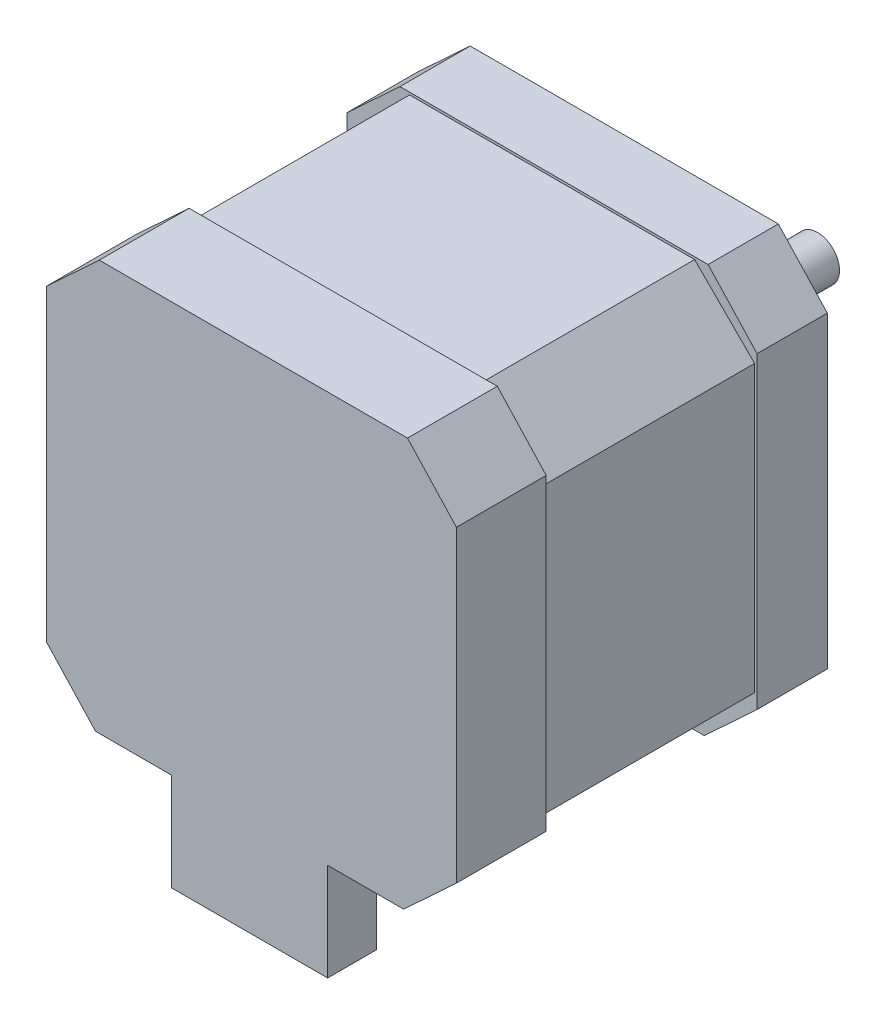
ISO-10303-21;
HEADER;
FILE_DESCRIPTION(('STEP AP214'),'2;1');
FILE_NAME('part.step','',(''),(''),'','','');
FILE_SCHEMA(('AUTOMOTIVE_DESIGN { 1 0 10303 214 1 1 1 1 }'));
ENDSEC;
DATA;
#1=APPLICATION_CONTEXT('core data for automotive mechanical design processes');
#2=APPLICATION_PROTOCOL_DEFINITION('international standard','automotive_design',2000,#1);
#3=PRODUCT_CONTEXT('',#1,'mechanical');
#4=PRODUCT('Part','Part','',(#3));
#5=PRODUCT_RELATED_PRODUCT_CATEGORY('part','',(#4));
#6=PRODUCT_DEFINITION_FORMATION('','',#4);
#7=PRODUCT_DEFINITION_CONTEXT('part definition',#1,'design');
#8=PRODUCT_DEFINITION('design','',#6,#7);
#9=PRODUCT_DEFINITION_SHAPE('','',#8);
#10=(LENGTH_UNIT() NAMED_UNIT(*) SI_UNIT(.MILLI.,.METRE.));
#11=(NAMED_UNIT(*) PLANE_ANGLE_UNIT() SI_UNIT($,.RADIAN.));
#12=(NAMED_UNIT(*) SI_UNIT($,.STERADIAN.) SOLID_ANGLE_UNIT());
#13=UNCERTAINTY_MEASURE_WITH_UNIT(LENGTH_MEASURE(1.E-05),#10,'distance_accuracy_value','');
#14=(GEOMETRIC_REPRESENTATION_CONTEXT(3) GLOBAL_UNCERTAINTY_ASSIGNED_CONTEXT((#13)) GLOBAL_UNIT_ASSIGNED_CONTEXT((#10,
#11,#12)) REPRESENTATION_CONTEXT('',''));
#15=CARTESIAN_POINT('',(0.,0.,0.));
#16=DIRECTION('',(0.,0.,1.));
#17=DIRECTION('',(1.,0.,0.));
#18=AXIS2_PLACEMENT_3D('',#15,#16,#17);
#19=CARTESIAN_POINT('',(0.,-21.,38.));
#20=DIRECTION('',(0.,1.,0.));
#21=DIRECTION('',(0.,0.,1.));
#22=AXIS2_PLACEMENT_3D('',#19,#20,#21);
#23=PLANE('',#22);
#24=DIRECTION('',(0.,0.,-1.));
#25=VECTOR('',#24,1.);
#26=CARTESIAN_POINT('',(-8.19600206182443,-21.,33.));
#27=LINE('',#26,#25);
#28=CARTESIAN_POINT('',(-8.19600206182443,-21.,38.));
#29=VERTEX_POINT('',#28);
#30=CARTESIAN_POINT('',(-8.19600206182443,-21.,33.));
#31=VERTEX_POINT('',#30);
#32=EDGE_CURVE('E290',#29,#31,#27,.T.);
#33=ORIENTED_EDGE('',*,*,#32,.F.);
#34=DIRECTION('',(1.,0.,0.));
#35=VECTOR('',#34,1.);
#36=CARTESIAN_POINT('',(0.,-21.,38.));
#37=LINE('',#36,#35);
#38=CARTESIAN_POINT('',(-15.9841759962391,-21.,38.));
#39=VERTEX_POINT('',#38);
#40=EDGE_CURVE('E441',#39,#29,#37,.T.);
#41=ORIENTED_EDGE('',*,*,#40,.F.);
#42=DIRECTION('',(0.,0.,-1.));
#43=VECTOR('',#42,1.);
#44=CARTESIAN_POINT('',(-15.9841759962391,-21.,38.));
#45=LINE('',#44,#43);
#46=CARTESIAN_POINT('',(-15.9841759962391,-21.,28.8));
#47=VERTEX_POINT('',#46);
#48=EDGE_CURVE('E477',#39,#47,#45,.T.);
#49=ORIENTED_EDGE('',*,*,#48,.T.);
#50=DIRECTION('',(-1.,0.,0.));
#51=VECTOR('',#50,1.);
#52=CARTESIAN_POINT('',(0.,-21.,28.8));
#53=LINE('',#52,#51);
#54=CARTESIAN_POINT('',(15.5921718725902,-21.,28.8));
#55=VERTEX_POINT('',#54);
#56=EDGE_CURVE('E405',#55,#47,#53,.T.);
#57=ORIENTED_EDGE('',*,*,#56,.F.);
#58=DIRECTION('',(0.,0.,-1.));
#59=VECTOR('',#58,1.);
#60=CARTESIAN_POINT('',(15.5921718725902,-21.,38.));
#61=LINE('',#60,#59);
#62=CARTESIAN_POINT('',(15.5921718725902,-21.,38.));
#63=VERTEX_POINT('',#62);
#64=EDGE_CURVE('E473',#63,#55,#61,.T.);
#65=ORIENTED_EDGE('',*,*,#64,.F.);
#66=CARTESIAN_POINT('',(7.80399793817557,-21.,38.));
#67=VERTEX_POINT('',#66);
#68=EDGE_CURVE('E105',#67,#63,#37,.T.);
#69=ORIENTED_EDGE('',*,*,#68,.F.);
#70=DIRECTION('',(0.,0.,1.));
#71=VECTOR('',#70,1.);
#72=CARTESIAN_POINT('',(7.80399793817557,-21.,33.));
#73=LINE('',#72,#71);
#74=CARTESIAN_POINT('',(7.80399793817557,-21.,33.));
#75=VERTEX_POINT('',#74);
#76=EDGE_CURVE('E287',#75,#67,#73,.T.);
#77=ORIENTED_EDGE('',*,*,#76,.F.);
#78=DIRECTION('',(1.,0.,0.));
#79=VECTOR('',#78,1.);
#80=CARTESIAN_POINT('',(7.80399793817557,-21.,33.));
#81=LINE('',#80,#79);
#82=EDGE_CURVE('E99',#31,#75,#81,.T.);
#83=ORIENTED_EDGE('',*,*,#82,.F.);
#84=EDGE_LOOP('',(#33,#41,#49,#57,#65,#69,#77,#83));
#85=FACE_BOUND('',#84,.T.);
#86=ADVANCED_FACE('F84',(#85),#23,.F.);
#87=CARTESIAN_POINT('',(21.,0.,38.));
#88=DIRECTION('',(1.,0.,0.));
#89=DIRECTION('',(0.,1.,0.));
#90=AXIS2_PLACEMENT_3D('',#87,#88,#89);
#91=PLANE('',#90);
#92=DIRECTION('',(0.,0.,-1.));
#93=VECTOR('',#92,1.);
#94=CARTESIAN_POINT('',(21.,-15.9841759962391,38.));
#95=LINE('',#94,#93);
#96=CARTESIAN_POINT('',(21.,-15.9841759962391,38.));
#97=VERTEX_POINT('',#96);
#98=CARTESIAN_POINT('',(21.,-15.9841759962391,28.8));
#99=VERTEX_POINT('',#98);
#100=EDGE_CURVE('E469',#97,#99,#95,.T.);
#101=ORIENTED_EDGE('',*,*,#100,.T.);
#102=DIRECTION('',(0.,1.,0.));
#103=VECTOR('',#102,1.);
#104=CARTESIAN_POINT('',(21.,0.,28.8));
#105=LINE('',#104,#103);
#106=CARTESIAN_POINT('',(21.,15.5921718725903,28.8));
#107=VERTEX_POINT('',#106);
#108=EDGE_CURVE('E420',#99,#107,#105,.T.);
#109=ORIENTED_EDGE('',*,*,#108,.T.);
#110=DIRECTION('',(0.,0.,-1.));
#111=VECTOR('',#110,1.);
#112=CARTESIAN_POINT('',(21.,15.5921718725903,38.));
#113=LINE('',#112,#111);
#114=CARTESIAN_POINT('',(21.,15.5921718725903,38.));
#115=VERTEX_POINT('',#114);
#116=EDGE_CURVE('E497',#115,#107,#113,.T.);
#117=ORIENTED_EDGE('',*,*,#116,.F.);
#118=DIRECTION('',(0.,-1.,0.));
#119=VECTOR('',#118,1.);
#120=CARTESIAN_POINT('',(21.,0.,38.));
#121=LINE('',#120,#119);
#122=EDGE_CURVE('E424',#115,#97,#121,.T.);
#123=ORIENTED_EDGE('',*,*,#122,.T.);
#124=EDGE_LOOP('',(#101,#109,#117,#123));
#125=FACE_BOUND('',#124,.T.);
#126=ADVANCED_FACE('F86',(#125),#91,.T.);
#127=CARTESIAN_POINT('',(19.0627004123154,17.6808781736177,38.));
#128=DIRECTION('',(-0.733180785089054,-0.680033775908373,0.));
#129=DIRECTION('',(0.680033775908373,-0.733180785089054,0.));
#130=AXIS2_PLACEMENT_3D('',#127,#128,#129);
#131=PLANE('',#130);
#132=DIRECTION('',(0.680033775908373,-0.733180785089054,0.));
#133=VECTOR('',#132,1.);
#134=CARTESIAN_POINT('',(19.0627004123154,17.6808781736177,28.8));
#135=LINE('',#134,#133);
#136=CARTESIAN_POINT('',(15.9841759962391,21.,28.8));
#137=VERTEX_POINT('',#136);
#138=EDGE_CURVE('E418',#137,#107,#135,.T.);
#139=ORIENTED_EDGE('',*,*,#138,.F.);
#140=DIRECTION('',(0.,0.,-1.));
#141=VECTOR('',#140,1.);
#142=CARTESIAN_POINT('',(15.9841759962391,21.,38.));
#143=LINE('',#142,#141);
#144=CARTESIAN_POINT('',(15.9841759962391,21.,38.));
#145=VERTEX_POINT('',#144);
#146=EDGE_CURVE('E493',#145,#137,#143,.T.);
#147=ORIENTED_EDGE('',*,*,#146,.F.);
#148=DIRECTION('',(-0.680033775908373,0.733180785089054,0.));
#149=VECTOR('',#148,1.);
#150=CARTESIAN_POINT('',(19.0627004123154,17.6808781736177,38.));
#151=LINE('',#150,#149);
#152=EDGE_CURVE('E427',#115,#145,#151,.T.);
#153=ORIENTED_EDGE('',*,*,#152,.F.);
#154=ORIENTED_EDGE('',*,*,#116,.T.);
#155=EDGE_LOOP('',(#139,#147,#153,#154));
#156=FACE_BOUND('',#155,.T.);
#157=ADVANCED_FACE('F618',(#156),#131,.F.);
#158=CARTESIAN_POINT('',(0.,21.,38.));
#159=DIRECTION('',(0.,1.,0.));
#160=DIRECTION('',(0.,0.,1.));
#161=AXIS2_PLACEMENT_3D('',#158,#159,#160);
#162=PLANE('',#161);
#163=ORIENTED_EDGE('',*,*,#146,.T.);
#164=DIRECTION('',(-1.,0.,0.));
#165=VECTOR('',#164,1.);
#166=CARTESIAN_POINT('',(0.,21.,28.8));
#167=LINE('',#166,#165);
#168=CARTESIAN_POINT('',(-15.5921718725903,21.,28.8));
#169=VERTEX_POINT('',#168);
#170=EDGE_CURVE('E415',#137,#169,#167,.T.);
#171=ORIENTED_EDGE('',*,*,#170,.T.);
#172=DIRECTION('',(0.,0.,-1.));
#173=VECTOR('',#172,1.);
#174=CARTESIAN_POINT('',(-15.5921718725903,21.,38.));
#175=LINE('',#174,#173);
#176=CARTESIAN_POINT('',(-15.5921718725903,21.,38.));
#177=VERTEX_POINT('',#176);
#178=EDGE_CURVE('E489',#177,#169,#175,.T.);
#179=ORIENTED_EDGE('',*,*,#178,.F.);
#180=DIRECTION('',(1.,0.,0.));
#181=VECTOR('',#180,1.);
#182=CARTESIAN_POINT('',(0.,21.,38.));
#183=LINE('',#182,#181);
#184=EDGE_CURVE('E430',#177,#145,#183,.T.);
#185=ORIENTED_EDGE('',*,*,#184,.T.);
#186=EDGE_LOOP('',(#163,#171,#179,#185));
#187=FACE_BOUND('',#186,.T.);
#188=ADVANCED_FACE('F663',(#187),#162,.T.);
#189=CARTESIAN_POINT('',(-17.6808781736177,19.0627004123154,38.));
#190=DIRECTION('',(-0.680033775908373,0.733180785089054,0.));
#191=DIRECTION('',(-0.733180785089054,-0.680033775908373,0.));
#192=AXIS2_PLACEMENT_3D('',#189,#190,#191);
#193=PLANE('',#192);
#194=ORIENTED_EDGE('',*,*,#178,.T.);
#195=DIRECTION('',(-0.733180785089054,-0.680033775908373,0.));
#196=VECTOR('',#195,1.);
#197=CARTESIAN_POINT('',(-17.6808781736177,19.0627004123154,28.8));
#198=LINE('',#197,#196);
#199=CARTESIAN_POINT('',(-21.,15.9841759962391,28.8));
#200=VERTEX_POINT('',#199);
#201=EDGE_CURVE('E412',#169,#200,#198,.T.);
#202=ORIENTED_EDGE('',*,*,#201,.T.);
#203=DIRECTION('',(0.,0.,-1.));
#204=VECTOR('',#203,1.);
#205=CARTESIAN_POINT('',(-21.,15.9841759962391,38.));
#206=LINE('',#205,#204);
#207=CARTESIAN_POINT('',(-21.,15.9841759962391,38.));
#208=VERTEX_POINT('',#207);
#209=EDGE_CURVE('E485',#208,#200,#206,.T.);
#210=ORIENTED_EDGE('',*,*,#209,.F.);
#211=DIRECTION('',(0.733180785089054,0.680033775908373,0.));
#212=VECTOR('',#211,1.);
#213=CARTESIAN_POINT('',(-17.6808781736177,19.0627004123154,38.));
#214=LINE('',#213,#212);
#215=EDGE_CURVE('E433',#208,#177,#214,.T.);
#216=ORIENTED_EDGE('',*,*,#215,.T.);
#217=EDGE_LOOP('',(#194,#202,#210,#216));
#218=FACE_BOUND('',#217,.T.);
#219=ADVANCED_FACE('F661',(#218),#193,.T.);
#220=CARTESIAN_POINT('',(-21.,0.,38.));
#221=DIRECTION('',(1.,0.,0.));
#222=DIRECTION('',(0.,1.,0.));
#223=AXIS2_PLACEMENT_3D('',#220,#221,#222);
#224=PLANE('',#223);
#225=DIRECTION('',(0.,1.,0.));
#226=VECTOR('',#225,1.);
#227=CARTESIAN_POINT('',(-21.,0.,28.8));
#228=LINE('',#227,#226);
#229=CARTESIAN_POINT('',(-21.,-15.5921718725903,28.8));
#230=VERTEX_POINT('',#229);
#231=EDGE_CURVE('E410',#230,#200,#228,.T.);
#232=ORIENTED_EDGE('',*,*,#231,.F.);
#233=DIRECTION('',(0.,0.,-1.));
#234=VECTOR('',#233,1.);
#235=CARTESIAN_POINT('',(-21.,-15.5921718725903,38.));
#236=LINE('',#235,#234);
#237=CARTESIAN_POINT('',(-21.,-15.5921718725903,38.));
#238=VERTEX_POINT('',#237);
#239=EDGE_CURVE('E481',#238,#230,#236,.T.);
#240=ORIENTED_EDGE('',*,*,#239,.F.);
#241=DIRECTION('',(0.,-1.,0.));
#242=VECTOR('',#241,1.);
#243=CARTESIAN_POINT('',(-21.,0.,38.));
#244=LINE('',#243,#242);
#245=EDGE_CURVE('E436',#208,#238,#244,.T.);
#246=ORIENTED_EDGE('',*,*,#245,.F.);
#247=ORIENTED_EDGE('',*,*,#209,.T.);
#248=EDGE_LOOP('',(#232,#240,#246,#247));
#249=FACE_BOUND('',#248,.T.);
#250=ADVANCED_FACE('F640',(#249),#224,.F.);
#251=CARTESIAN_POINT('',(-19.0627004123154,-17.6808781736177,38.));
#252=DIRECTION('',(-0.733180785089054,-0.680033775908373,0.));
#253=DIRECTION('',(0.680033775908373,-0.733180785089054,0.));
#254=AXIS2_PLACEMENT_3D('',#251,#252,#253);
#255=PLANE('',#254);
#256=ORIENTED_EDGE('',*,*,#239,.T.);
#257=DIRECTION('',(0.680033775908373,-0.733180785089054,0.));
#258=VECTOR('',#257,1.);
#259=CARTESIAN_POINT('',(-19.0627004123154,-17.6808781736177,28.8));
#260=LINE('',#259,#258);
#261=EDGE_CURVE('E407',#230,#47,#260,.T.);
#262=ORIENTED_EDGE('',*,*,#261,.T.);
#263=ORIENTED_EDGE('',*,*,#48,.F.);
#264=DIRECTION('',(-0.680033775908373,0.733180785089054,0.));
#265=VECTOR('',#264,1.);
#266=CARTESIAN_POINT('',(-19.0627004123154,-17.6808781736177,38.));
#267=LINE('',#266,#265);
#268=EDGE_CURVE('E438',#39,#238,#267,.T.);
#269=ORIENTED_EDGE('',*,*,#268,.T.);
#270=EDGE_LOOP('',(#256,#262,#263,#269));
#271=FACE_BOUND('',#270,.T.);
#272=ADVANCED_FACE('F627',(#271),#255,.T.);
#273=CARTESIAN_POINT('',(17.6808781736177,-19.0627004123154,38.));
#274=DIRECTION('',(-0.680033775908373,0.733180785089054,0.));
#275=DIRECTION('',(-0.733180785089054,-0.680033775908373,0.));
#276=AXIS2_PLACEMENT_3D('',#273,#274,#275);
#277=PLANE('',#276);
#278=DIRECTION('',(-0.733180785089054,-0.680033775908373,0.));
#279=VECTOR('',#278,1.);
#280=CARTESIAN_POINT('',(17.6808781736177,-19.0627004123154,28.8));
#281=LINE('',#280,#279);
#282=EDGE_CURVE('E92',#99,#55,#281,.T.);
#283=ORIENTED_EDGE('',*,*,#282,.F.);
#284=ORIENTED_EDGE('',*,*,#100,.F.);
#285=DIRECTION('',(0.733180785089054,0.680033775908373,0.));
#286=VECTOR('',#285,1.);
#287=CARTESIAN_POINT('',(17.6808781736177,-19.0627004123154,38.));
#288=LINE('',#287,#286);
#289=EDGE_CURVE('E444',#63,#97,#288,.T.);
#290=ORIENTED_EDGE('',*,*,#289,.F.);
#291=ORIENTED_EDGE('',*,*,#64,.T.);
#292=EDGE_LOOP('',(#283,#284,#290,#291));
#293=FACE_BOUND('',#292,.T.);
#294=ADVANCED_FACE('F628',(#293),#277,.F.);
#295=CARTESIAN_POINT('',(0.,0.,38.));
#296=DIRECTION('',(0.,0.,1.));
#297=DIRECTION('',(1.,0.,0.));
#298=AXIS2_PLACEMENT_3D('',#295,#296,#297);
#299=PLANE('',#298);
#300=ORIENTED_EDGE('',*,*,#122,.F.);
#301=ORIENTED_EDGE('',*,*,#152,.T.);
#302=ORIENTED_EDGE('',*,*,#184,.F.);
#303=ORIENTED_EDGE('',*,*,#215,.F.);
#304=ORIENTED_EDGE('',*,*,#245,.T.);
#305=ORIENTED_EDGE('',*,*,#268,.F.);
#306=ORIENTED_EDGE('',*,*,#40,.T.);
#307=DIRECTION('',(0.,1.,0.));
#308=VECTOR('',#307,1.);
#309=CARTESIAN_POINT('',(-8.19600206182443,-31.,38.));
#310=LINE('',#309,#308);
#311=CARTESIAN_POINT('',(-8.19600206182443,-31.,38.));
#312=VERTEX_POINT('',#311);
#313=EDGE_CURVE('E664',#312,#29,#310,.T.);
#314=ORIENTED_EDGE('',*,*,#313,.F.);
#315=DIRECTION('',(-1.,0.,0.));
#316=VECTOR('',#315,1.);
#317=CARTESIAN_POINT('',(7.80399793817557,-31.,38.));
#318=LINE('',#317,#316);
#319=CARTESIAN_POINT('',(7.80399793817557,-31.,38.));
#320=VERTEX_POINT('',#319);
#321=EDGE_CURVE('E283',#320,#312,#318,.T.);
#322=ORIENTED_EDGE('',*,*,#321,.F.);
#323=DIRECTION('',(0.,1.,0.));
#324=VECTOR('',#323,1.);
#325=CARTESIAN_POINT('',(7.80399793817557,-31.,38.));
#326=LINE('',#325,#324);
#327=EDGE_CURVE('E296',#320,#67,#326,.T.);
#328=ORIENTED_EDGE('',*,*,#327,.T.);
#329=ORIENTED_EDGE('',*,*,#68,.T.);
#330=ORIENTED_EDGE('',*,*,#289,.T.);
#331=EDGE_LOOP('',(#300,#301,#302,#303,#304,#305,#306,#314,#322,#328,#329,#330));
#332=FACE_BOUND('',#331,.T.);
#333=ADVANCED_FACE('F632',(#332),#299,.T.);
#334=CARTESIAN_POINT('',(0.,0.,28.8));
#335=DIRECTION('',(0.,0.,-1.));
#336=DIRECTION('',(-1.,0.,0.));
#337=AXIS2_PLACEMENT_3D('',#334,#335,#336);
#338=PLANE('',#337);
#339=ORIENTED_EDGE('',*,*,#282,.T.);
#340=ORIENTED_EDGE('',*,*,#56,.T.);
#341=ORIENTED_EDGE('',*,*,#261,.F.);
#342=ORIENTED_EDGE('',*,*,#231,.T.);
#343=ORIENTED_EDGE('',*,*,#201,.F.);
#344=ORIENTED_EDGE('',*,*,#170,.F.);
#345=ORIENTED_EDGE('',*,*,#138,.T.);
#346=ORIENTED_EDGE('',*,*,#108,.F.);
#347=EDGE_LOOP('',(#339,#340,#341,#342,#343,#344,#345,#346));
#348=FACE_BOUND('',#347,.T.);
#349=DIRECTION('',(-0.707106781186548,0.707106781186547,0.));
#350=VECTOR('',#349,1.);
#351=CARTESIAN_POINT('',(17.6776695296637,17.6776695296637,28.8));
#352=LINE('',#351,#350);
#353=CARTESIAN_POINT('',(20.75,14.6053390593274,28.8));
#354=VERTEX_POINT('',#353);
#355=CARTESIAN_POINT('',(14.6053390593274,20.75,28.8));
#356=VERTEX_POINT('',#355);
#357=EDGE_CURVE('E349',#354,#356,#352,.T.);
#358=ORIENTED_EDGE('',*,*,#357,.T.);
#359=DIRECTION('',(1.,0.,0.));
#360=VECTOR('',#359,1.);
#361=CARTESIAN_POINT('',(0.,20.75,28.8));
#362=LINE('',#361,#360);
#363=CARTESIAN_POINT('',(-14.6053390593274,20.75,28.8));
#364=VERTEX_POINT('',#363);
#365=EDGE_CURVE('E352',#364,#356,#362,.T.);
#366=ORIENTED_EDGE('',*,*,#365,.F.);
#367=DIRECTION('',(0.707106781186547,0.707106781186548,0.));
#368=VECTOR('',#367,1.);
#369=CARTESIAN_POINT('',(-17.6776695296637,17.6776695296637,28.8));
#370=LINE('',#369,#368);
#371=CARTESIAN_POINT('',(-20.75,14.6053390593274,28.8));
#372=VERTEX_POINT('',#371);
#373=EDGE_CURVE('E355',#372,#364,#370,.T.);
#374=ORIENTED_EDGE('',*,*,#373,.F.);
#375=DIRECTION('',(0.,1.,0.));
#376=VECTOR('',#375,1.);
#377=CARTESIAN_POINT('',(-20.75,0.,28.8));
#378=LINE('',#377,#376);
#379=CARTESIAN_POINT('',(-20.75,-14.6053390593274,28.8));
#380=VERTEX_POINT('',#379);
#381=EDGE_CURVE('E358',#380,#372,#378,.T.);
#382=ORIENTED_EDGE('',*,*,#381,.F.);
#383=DIRECTION('',(-0.707106781186547,0.707106781186548,0.));
#384=VECTOR('',#383,1.);
#385=CARTESIAN_POINT('',(-17.6776695296637,-17.6776695296637,28.8));
#386=LINE('',#385,#384);
#387=CARTESIAN_POINT('',(-14.6053390593274,-20.75,28.8));
#388=VERTEX_POINT('',#387);
#389=EDGE_CURVE('E361',#388,#380,#386,.T.);
#390=ORIENTED_EDGE('',*,*,#389,.F.);
#391=DIRECTION('',(1.,0.,0.));
#392=VECTOR('',#391,1.);
#393=CARTESIAN_POINT('',(0.,-20.75,28.8));
#394=LINE('',#393,#392);
#395=CARTESIAN_POINT('',(14.6053390593274,-20.75,28.8));
#396=VERTEX_POINT('',#395);
#397=EDGE_CURVE('E364',#388,#396,#394,.T.);
#398=ORIENTED_EDGE('',*,*,#397,.T.);
#399=DIRECTION('',(0.707106781186547,0.707106781186548,0.));
#400=VECTOR('',#399,1.);
#401=CARTESIAN_POINT('',(17.6776695296637,-17.6776695296637,28.8));
#402=LINE('',#401,#400);
#403=CARTESIAN_POINT('',(20.75,-14.6053390593274,28.8));
#404=VERTEX_POINT('',#403);
#405=EDGE_CURVE('E367',#396,#404,#402,.T.);
#406=ORIENTED_EDGE('',*,*,#405,.T.);
#407=DIRECTION('',(0.,1.,0.));
#408=VECTOR('',#407,1.);
#409=CARTESIAN_POINT('',(20.75,0.,28.8));
#410=LINE('',#409,#408);
#411=EDGE_CURVE('E327',#404,#354,#410,.T.);
#412=ORIENTED_EDGE('',*,*,#411,.T.);
#413=EDGE_LOOP('',(#358,#366,#374,#382,#390,#398,#406,#412));
#414=FACE_BOUND('',#413,.T.);
#415=ADVANCED_FACE('F579',(#348,#414),#338,.T.);
#416=CARTESIAN_POINT('',(17.6776695296637,17.6776695296637,-86.9741340859453));
#417=DIRECTION('',(0.707106781186547,0.707106781186548,0.));
#418=DIRECTION('',(-0.707106781186548,0.707106781186547,0.));
#419=AXIS2_PLACEMENT_3D('',#416,#417,#418);
#420=PLANE('',#419);
#421=DIRECTION('',(0.,0.,1.));
#422=VECTOR('',#421,1.);
#423=CARTESIAN_POINT('',(14.6053390593274,20.75,-86.9741340859453));
#424=LINE('',#423,#422);
#425=CARTESIAN_POINT('',(14.6053390593274,20.75,7.2));
#426=VERTEX_POINT('',#425);
#427=EDGE_CURVE('E383',#426,#356,#424,.T.);
#428=ORIENTED_EDGE('',*,*,#427,.T.);
#429=ORIENTED_EDGE('',*,*,#357,.F.);
#430=DIRECTION('',(0.,0.,1.));
#431=VECTOR('',#430,1.);
#432=CARTESIAN_POINT('',(20.75,14.6053390593274,-86.9741340859453));
#433=LINE('',#432,#431);
#434=CARTESIAN_POINT('',(20.75,14.6053390593274,7.2));
#435=VERTEX_POINT('',#434);
#436=EDGE_CURVE('E370',#435,#354,#433,.T.);
#437=ORIENTED_EDGE('',*,*,#436,.F.);
#438=DIRECTION('',(0.707106781186548,-0.707106781186547,0.));
#439=VECTOR('',#438,1.);
#440=CARTESIAN_POINT('',(17.6776695296637,17.6776695296637,7.2));
#441=LINE('',#440,#439);
#442=EDGE_CURVE('E346',#426,#435,#441,.T.);
#443=ORIENTED_EDGE('',*,*,#442,.F.);
#444=EDGE_LOOP('',(#428,#429,#437,#443));
#445=FACE_BOUND('',#444,.T.);
#446=ADVANCED_FACE('F573',(#445),#420,.T.);
#447=CARTESIAN_POINT('',(0.,20.75,-86.9741340859453));
#448=DIRECTION('',(0.,-1.,0.));
#449=DIRECTION('',(0.,0.,-1.));
#450=AXIS2_PLACEMENT_3D('',#447,#448,#449);
#451=PLANE('',#450);
#452=DIRECTION('',(-1.,0.,0.));
#453=VECTOR('',#452,1.);
#454=CARTESIAN_POINT('',(0.,20.75,7.2));
#455=LINE('',#454,#453);
#456=CARTESIAN_POINT('',(-14.6053390593274,20.75,7.2));
#457=VERTEX_POINT('',#456);
#458=EDGE_CURVE('E328',#426,#457,#455,.T.);
#459=ORIENTED_EDGE('',*,*,#458,.T.);
#460=DIRECTION('',(0.,0.,1.));
#461=VECTOR('',#460,1.);
#462=CARTESIAN_POINT('',(-14.6053390593274,20.75,-86.9741340859453));
#463=LINE('',#462,#461);
#464=EDGE_CURVE('E381',#457,#364,#463,.T.);
#465=ORIENTED_EDGE('',*,*,#464,.T.);
#466=ORIENTED_EDGE('',*,*,#365,.T.);
#467=ORIENTED_EDGE('',*,*,#427,.F.);
#468=EDGE_LOOP('',(#459,#465,#466,#467));
#469=FACE_BOUND('',#468,.T.);
#470=ADVANCED_FACE('F604',(#469),#451,.F.);
#471=CARTESIAN_POINT('',(-17.6776695296637,17.6776695296637,-86.9741340859453));
#472=DIRECTION('',(0.707106781186548,-0.707106781186547,0.));
#473=DIRECTION('',(0.707106781186547,0.707106781186548,0.));
#474=AXIS2_PLACEMENT_3D('',#471,#472,#473);
#475=PLANE('',#474);
#476=DIRECTION('',(-0.707106781186547,-0.707106781186548,0.));
#477=VECTOR('',#476,1.);
#478=CARTESIAN_POINT('',(-17.6776695296637,17.6776695296637,7.2));
#479=LINE('',#478,#477);
#480=CARTESIAN_POINT('',(-20.75,14.6053390593274,7.2));
#481=VERTEX_POINT('',#480);
#482=EDGE_CURVE('E331',#457,#481,#479,.T.);
#483=ORIENTED_EDGE('',*,*,#482,.T.);
#484=DIRECTION('',(0.,0.,1.));
#485=VECTOR('',#484,1.);
#486=CARTESIAN_POINT('',(-20.75,14.6053390593274,-86.9741340859453));
#487=LINE('',#486,#485);
#488=EDGE_CURVE('E379',#481,#372,#487,.T.);
#489=ORIENTED_EDGE('',*,*,#488,.T.);
#490=ORIENTED_EDGE('',*,*,#373,.T.);
#491=ORIENTED_EDGE('',*,*,#464,.F.);
#492=EDGE_LOOP('',(#483,#489,#490,#491));
#493=FACE_BOUND('',#492,.T.);
#494=ADVANCED_FACE('F602',(#493),#475,.F.);
#495=CARTESIAN_POINT('',(-20.75,0.,-86.9741340859453));
#496=DIRECTION('',(1.,0.,0.));
#497=DIRECTION('',(0.,0.,-1.));
#498=AXIS2_PLACEMENT_3D('',#495,#496,#497);
#499=PLANE('',#498);
#500=DIRECTION('',(0.,-1.,0.));
#501=VECTOR('',#500,1.);
#502=CARTESIAN_POINT('',(-20.75,0.,7.2));
#503=LINE('',#502,#501);
#504=CARTESIAN_POINT('',(-20.75,-14.6053390593274,7.2));
#505=VERTEX_POINT('',#504);
#506=EDGE_CURVE('E333',#481,#505,#503,.T.);
#507=ORIENTED_EDGE('',*,*,#506,.T.);
#508=DIRECTION('',(0.,0.,1.));
#509=VECTOR('',#508,1.);
#510=CARTESIAN_POINT('',(-20.75,-14.6053390593274,-86.9741340859453));
#511=LINE('',#510,#509);
#512=EDGE_CURVE('E377',#505,#380,#511,.T.);
#513=ORIENTED_EDGE('',*,*,#512,.T.);
#514=ORIENTED_EDGE('',*,*,#381,.T.);
#515=ORIENTED_EDGE('',*,*,#488,.F.);
#516=EDGE_LOOP('',(#507,#513,#514,#515));
#517=FACE_BOUND('',#516,.T.);
#518=ADVANCED_FACE('F599',(#517),#499,.F.);
#519=CARTESIAN_POINT('',(-17.6776695296637,-17.6776695296637,-86.9741340859453));
#520=DIRECTION('',(0.707106781186548,0.707106781186547,0.));
#521=DIRECTION('',(-0.707106781186547,0.707106781186548,0.));
#522=AXIS2_PLACEMENT_3D('',#519,#520,#521);
#523=PLANE('',#522);
#524=DIRECTION('',(0.707106781186547,-0.707106781186548,0.));
#525=VECTOR('',#524,1.);
#526=CARTESIAN_POINT('',(-17.6776695296637,-17.6776695296637,7.2));
#527=LINE('',#526,#525);
#528=CARTESIAN_POINT('',(-14.6053390593274,-20.75,7.2));
#529=VERTEX_POINT('',#528);
#530=EDGE_CURVE('E335',#505,#529,#527,.T.);
#531=ORIENTED_EDGE('',*,*,#530,.T.);
#532=DIRECTION('',(0.,0.,1.));
#533=VECTOR('',#532,1.);
#534=CARTESIAN_POINT('',(-14.6053390593274,-20.75,-86.9741340859453));
#535=LINE('',#534,#533);
#536=EDGE_CURVE('E375',#529,#388,#535,.T.);
#537=ORIENTED_EDGE('',*,*,#536,.T.);
#538=ORIENTED_EDGE('',*,*,#389,.T.);
#539=ORIENTED_EDGE('',*,*,#512,.F.);
#540=EDGE_LOOP('',(#531,#537,#538,#539));
#541=FACE_BOUND('',#540,.T.);
#542=ADVANCED_FACE('F593',(#541),#523,.F.);
#543=CARTESIAN_POINT('',(0.,-20.75,-86.9741340859453));
#544=DIRECTION('',(0.,-1.,0.));
#545=DIRECTION('',(0.,0.,-1.));
#546=AXIS2_PLACEMENT_3D('',#543,#544,#545);
#547=PLANE('',#546);
#548=DIRECTION('',(0.,0.,1.));
#549=VECTOR('',#548,1.);
#550=CARTESIAN_POINT('',(14.6053390593274,-20.75,-86.9741340859453));
#551=LINE('',#550,#549);
#552=CARTESIAN_POINT('',(14.6053390593274,-20.75,7.2));
#553=VERTEX_POINT('',#552);
#554=EDGE_CURVE('E373',#553,#396,#551,.T.);
#555=ORIENTED_EDGE('',*,*,#554,.T.);
#556=ORIENTED_EDGE('',*,*,#397,.F.);
#557=ORIENTED_EDGE('',*,*,#536,.F.);
#558=DIRECTION('',(-1.,0.,0.));
#559=VECTOR('',#558,1.);
#560=CARTESIAN_POINT('',(0.,-20.75,7.2));
#561=LINE('',#560,#559);
#562=EDGE_CURVE('E337',#553,#529,#561,.T.);
#563=ORIENTED_EDGE('',*,*,#562,.F.);
#564=EDGE_LOOP('',(#555,#556,#557,#563));
#565=FACE_BOUND('',#564,.T.);
#566=ADVANCED_FACE('F591',(#565),#547,.T.);
#567=CARTESIAN_POINT('',(17.6776695296637,-17.6776695296637,-86.9741340859453));
#568=DIRECTION('',(0.707106781186548,-0.707106781186547,0.));
#569=DIRECTION('',(0.707106781186547,0.707106781186548,0.));
#570=AXIS2_PLACEMENT_3D('',#567,#568,#569);
#571=PLANE('',#570);
#572=DIRECTION('',(0.,0.,1.));
#573=VECTOR('',#572,1.);
#574=CARTESIAN_POINT('',(20.75,-14.6053390593274,-86.9741340859453));
#575=LINE('',#574,#573);
#576=CARTESIAN_POINT('',(20.75,-14.6053390593274,7.2));
#577=VERTEX_POINT('',#576);
#578=EDGE_CURVE('E371',#577,#404,#575,.T.);
#579=ORIENTED_EDGE('',*,*,#578,.T.);
#580=ORIENTED_EDGE('',*,*,#405,.F.);
#581=ORIENTED_EDGE('',*,*,#554,.F.);
#582=DIRECTION('',(-0.707106781186547,-0.707106781186548,0.));
#583=VECTOR('',#582,1.);
#584=CARTESIAN_POINT('',(17.6776695296637,-17.6776695296637,7.2));
#585=LINE('',#584,#583);
#586=EDGE_CURVE('E340',#577,#553,#585,.T.);
#587=ORIENTED_EDGE('',*,*,#586,.F.);
#588=EDGE_LOOP('',(#579,#580,#581,#587));
#589=FACE_BOUND('',#588,.T.);
#590=ADVANCED_FACE('F586',(#589),#571,.T.);
#591=CARTESIAN_POINT('',(20.75,0.,-86.9741340859453));
#592=DIRECTION('',(1.,0.,0.));
#593=DIRECTION('',(0.,0.,-1.));
#594=AXIS2_PLACEMENT_3D('',#591,#592,#593);
#595=PLANE('',#594);
#596=ORIENTED_EDGE('',*,*,#436,.T.);
#597=ORIENTED_EDGE('',*,*,#411,.F.);
#598=ORIENTED_EDGE('',*,*,#578,.F.);
#599=DIRECTION('',(0.,-1.,0.));
#600=VECTOR('',#599,1.);
#601=CARTESIAN_POINT('',(20.75,0.,7.2));
#602=LINE('',#601,#600);
#603=EDGE_CURVE('E343',#435,#577,#602,.T.);
#604=ORIENTED_EDGE('',*,*,#603,.F.);
#605=EDGE_LOOP('',(#596,#597,#598,#604));
#606=FACE_BOUND('',#605,.T.);
#607=ADVANCED_FACE('F566',(#606),#595,.T.);
#608=CARTESIAN_POINT('',(0.,0.,7.2));
#609=DIRECTION('',(0.,0.,1.));
#610=DIRECTION('',(1.,0.,0.));
#611=AXIS2_PLACEMENT_3D('',#608,#609,#610);
#612=PLANE('',#611);
#613=DIRECTION('',(-0.680033775908373,0.733180785089054,0.));
#614=VECTOR('',#613,1.);
#615=CARTESIAN_POINT('',(19.0627004123154,17.6808781736177,7.2));
#616=LINE('',#615,#614);
#617=CARTESIAN_POINT('',(21.,15.5921718725903,7.2));
#618=VERTEX_POINT('',#617);
#619=CARTESIAN_POINT('',(15.9841759962391,21.,7.2));
#620=VERTEX_POINT('',#619);
#621=EDGE_CURVE('E400',#618,#620,#616,.T.);
#622=ORIENTED_EDGE('',*,*,#621,.T.);
#623=DIRECTION('',(1.,0.,0.));
#624=VECTOR('',#623,1.);
#625=CARTESIAN_POINT('',(0.,21.,7.2));
#626=LINE('',#625,#624);
#627=CARTESIAN_POINT('',(-15.5921718725903,21.,7.2));
#628=VERTEX_POINT('',#627);
#629=EDGE_CURVE('E397',#628,#620,#626,.T.);
#630=ORIENTED_EDGE('',*,*,#629,.F.);
#631=DIRECTION('',(0.733180785089054,0.680033775908373,0.));
#632=VECTOR('',#631,1.);
#633=CARTESIAN_POINT('',(-17.6808781736177,19.0627004123154,7.2));
#634=LINE('',#633,#632);
#635=CARTESIAN_POINT('',(-21.,15.9841759962391,7.2));
#636=VERTEX_POINT('',#635);
#637=EDGE_CURVE('E394',#636,#628,#634,.T.);
#638=ORIENTED_EDGE('',*,*,#637,.F.);
#639=DIRECTION('',(0.,-1.,0.));
#640=VECTOR('',#639,1.);
#641=CARTESIAN_POINT('',(-21.,0.,7.2));
#642=LINE('',#641,#640);
#643=CARTESIAN_POINT('',(-21.,-15.5921718725903,7.2));
#644=VERTEX_POINT('',#643);
#645=EDGE_CURVE('E392',#636,#644,#642,.T.);
#646=ORIENTED_EDGE('',*,*,#645,.T.);
#647=DIRECTION('',(-0.680033775908373,0.733180785089054,0.));
#648=VECTOR('',#647,1.);
#649=CARTESIAN_POINT('',(-19.0627004123154,-17.6808781736177,7.2));
#650=LINE('',#649,#648);
#651=CARTESIAN_POINT('',(-15.9841759962391,-21.,7.2));
#652=VERTEX_POINT('',#651);
#653=EDGE_CURVE('E389',#652,#644,#650,.T.);
#654=ORIENTED_EDGE('',*,*,#653,.F.);
#655=DIRECTION('',(1.,0.,0.));
#656=VECTOR('',#655,1.);
#657=CARTESIAN_POINT('',(0.,-21.,7.2));
#658=LINE('',#657,#656);
#659=CARTESIAN_POINT('',(15.5921718725902,-21.,7.2));
#660=VERTEX_POINT('',#659);
#661=EDGE_CURVE('E330',#652,#660,#658,.T.);
#662=ORIENTED_EDGE('',*,*,#661,.T.);
#663=DIRECTION('',(0.733180785089054,0.680033775908373,0.));
#664=VECTOR('',#663,1.);
#665=CARTESIAN_POINT('',(17.6808781736177,-19.0627004123154,7.2));
#666=LINE('',#665,#664);
#667=CARTESIAN_POINT('',(21.,-15.9841759962391,7.2));
#668=VERTEX_POINT('',#667);
#669=EDGE_CURVE('E500',#660,#668,#666,.T.);
#670=ORIENTED_EDGE('',*,*,#669,.T.);
#671=DIRECTION('',(0.,-1.,0.));
#672=VECTOR('',#671,1.);
#673=CARTESIAN_POINT('',(21.,0.,7.2));
#674=LINE('',#673,#672);
#675=EDGE_CURVE('E402',#618,#668,#674,.T.);
#676=ORIENTED_EDGE('',*,*,#675,.F.);
#677=EDGE_LOOP('',(#622,#630,#638,#646,#654,#662,#670,#676));
#678=FACE_BOUND('',#677,.T.);
#679=ORIENTED_EDGE('',*,*,#442,.T.);
#680=ORIENTED_EDGE('',*,*,#603,.T.);
#681=ORIENTED_EDGE('',*,*,#586,.T.);
#682=ORIENTED_EDGE('',*,*,#562,.T.);
#683=ORIENTED_EDGE('',*,*,#530,.F.);
#684=ORIENTED_EDGE('',*,*,#506,.F.);
#685=ORIENTED_EDGE('',*,*,#482,.F.);
#686=ORIENTED_EDGE('',*,*,#458,.F.);
#687=EDGE_LOOP('',(#679,#680,#681,#682,#683,#684,#685,#686));
#688=FACE_BOUND('',#687,.T.);
#689=ADVANCED_FACE('F526',(#678,#688),#612,.T.);
#690=CARTESIAN_POINT('',(0.,0.,0.));
#691=DIRECTION('',(0.,0.,1.));
#692=DIRECTION('',(1.,0.,0.));
#693=AXIS2_PLACEMENT_3D('',#690,#691,#692);
#694=PLANE('',#693);
#695=CARTESIAN_POINT('',(15.5,-15.5,0.));
#696=DIRECTION('',(0.,0.,-1.));
#697=DIRECTION('',(-1.,0.,0.));
#698=AXIS2_PLACEMENT_3D('',#695,#696,#697);
#699=CIRCLE('',#698,1.5);
#700=CARTESIAN_POINT('',(14.,-15.5,0.));
#701=VERTEX_POINT('',#700);
#702=EDGE_CURVE('E304',#701,#701,#699,.T.);
#703=ORIENTED_EDGE('',*,*,#702,.F.);
#704=EDGE_LOOP('',(#703));
#705=FACE_BOUND('',#704,.T.);
#706=CARTESIAN_POINT('',(15.5,15.5,0.));
#707=DIRECTION('',(0.,0.,-1.));
#708=DIRECTION('',(-1.,0.,0.));
#709=AXIS2_PLACEMENT_3D('',#706,#707,#708);
#710=CIRCLE('',#709,1.5);
#711=CARTESIAN_POINT('',(14.,15.5,0.));
#712=VERTEX_POINT('',#711);
#713=EDGE_CURVE('E310',#712,#712,#710,.T.);
#714=ORIENTED_EDGE('',*,*,#713,.F.);
#715=EDGE_LOOP('',(#714));
#716=FACE_BOUND('',#715,.T.);
#717=CARTESIAN_POINT('',(-15.5,15.5,0.));
#718=DIRECTION('',(0.,0.,-1.));
#719=DIRECTION('',(-1.,0.,0.));
#720=AXIS2_PLACEMENT_3D('',#717,#718,#719);
#721=CIRCLE('',#720,1.5);
#722=CARTESIAN_POINT('',(-17.,15.5,0.));
#723=VERTEX_POINT('',#722);
#724=EDGE_CURVE('E291',#723,#723,#721,.T.);
#725=ORIENTED_EDGE('',*,*,#724,.F.);
#726=EDGE_LOOP('',(#725));
#727=FACE_BOUND('',#726,.T.);
#728=CARTESIAN_POINT('',(-15.5,-15.5,0.));
#729=DIRECTION('',(0.,0.,-1.));
#730=DIRECTION('',(-1.,0.,0.));
#731=AXIS2_PLACEMENT_3D('',#728,#729,#730);
#732=CIRCLE('',#731,1.5);
#733=CARTESIAN_POINT('',(-17.,-15.5,0.));
#734=VERTEX_POINT('',#733);
#735=EDGE_CURVE('E303',#734,#734,#732,.T.);
#736=ORIENTED_EDGE('',*,*,#735,.F.);
#737=EDGE_LOOP('',(#736));
#738=FACE_BOUND('',#737,.T.);
#739=CARTESIAN_POINT('',(0.,0.,0.));
#740=DIRECTION('',(0.,0.,1.));
#741=DIRECTION('',(1.,0.,0.));
#742=AXIS2_PLACEMENT_3D('',#739,#740,#741);
#743=CIRCLE('',#742,10.);
#744=CARTESIAN_POINT('',(10.,0.,0.));
#745=VERTEX_POINT('',#744);
#746=EDGE_CURVE('E13',#745,#745,#743,.F.);
#747=ORIENTED_EDGE('',*,*,#746,.F.);
#748=EDGE_LOOP('',(#747));
#749=FACE_BOUND('',#748,.T.);
#750=DIRECTION('',(0.,-1.,0.));
#751=VECTOR('',#750,1.);
#752=CARTESIAN_POINT('',(21.,0.,0.));
#753=LINE('',#752,#751);
#754=CARTESIAN_POINT('',(21.,15.5921718725903,0.));
#755=VERTEX_POINT('',#754);
#756=CARTESIAN_POINT('',(21.,-15.9841759962391,0.));
#757=VERTEX_POINT('',#756);
#758=EDGE_CURVE('E423',#755,#757,#753,.T.);
#759=ORIENTED_EDGE('',*,*,#758,.T.);
#760=DIRECTION('',(0.733180785089054,0.680033775908373,0.));
#761=VECTOR('',#760,1.);
#762=CARTESIAN_POINT('',(17.6808781736177,-19.0627004123154,0.));
#763=LINE('',#762,#761);
#764=CARTESIAN_POINT('',(15.5921718725902,-21.,0.));
#765=VERTEX_POINT('',#764);
#766=EDGE_CURVE('E428',#765,#757,#763,.T.);
#767=ORIENTED_EDGE('',*,*,#766,.F.);
#768=DIRECTION('',(1.,0.,0.));
#769=VECTOR('',#768,1.);
#770=CARTESIAN_POINT('',(0.,-21.,0.));
#771=LINE('',#770,#769);
#772=CARTESIAN_POINT('',(-15.9841759962391,-21.,0.));
#773=VERTEX_POINT('',#772);
#774=EDGE_CURVE('E464',#773,#765,#771,.T.);
#775=ORIENTED_EDGE('',*,*,#774,.F.);
#776=DIRECTION('',(-0.680033775908373,0.733180785089054,0.));
#777=VECTOR('',#776,1.);
#778=CARTESIAN_POINT('',(-19.0627004123154,-17.6808781736177,0.));
#779=LINE('',#778,#777);
#780=CARTESIAN_POINT('',(-21.,-15.5921718725903,0.));
#781=VERTEX_POINT('',#780);
#782=EDGE_CURVE('E461',#773,#781,#779,.T.);
#783=ORIENTED_EDGE('',*,*,#782,.T.);
#784=DIRECTION('',(0.,-1.,0.));
#785=VECTOR('',#784,1.);
#786=CARTESIAN_POINT('',(-21.,0.,0.));
#787=LINE('',#786,#785);
#788=CARTESIAN_POINT('',(-21.,15.9841759962391,0.));
#789=VERTEX_POINT('',#788);
#790=EDGE_CURVE('E458',#789,#781,#787,.T.);
#791=ORIENTED_EDGE('',*,*,#790,.F.);
#792=DIRECTION('',(0.733180785089054,0.680033775908373,0.));
#793=VECTOR('',#792,1.);
#794=CARTESIAN_POINT('',(-17.6808781736177,19.0627004123154,0.));
#795=LINE('',#794,#793);
#796=CARTESIAN_POINT('',(-15.5921718725903,21.,0.));
#797=VERTEX_POINT('',#796);
#798=EDGE_CURVE('E455',#789,#797,#795,.T.);
#799=ORIENTED_EDGE('',*,*,#798,.T.);
#800=DIRECTION('',(1.,0.,0.));
#801=VECTOR('',#800,1.);
#802=CARTESIAN_POINT('',(0.,21.,0.));
#803=LINE('',#802,#801);
#804=CARTESIAN_POINT('',(15.9841759962391,21.,0.));
#805=VERTEX_POINT('',#804);
#806=EDGE_CURVE('E452',#797,#805,#803,.T.);
#807=ORIENTED_EDGE('',*,*,#806,.T.);
#808=DIRECTION('',(-0.680033775908373,0.733180785089054,0.));
#809=VECTOR('',#808,1.);
#810=CARTESIAN_POINT('',(19.0627004123154,17.6808781736177,0.));
#811=LINE('',#810,#809);
#812=EDGE_CURVE('E449',#755,#805,#811,.T.);
#813=ORIENTED_EDGE('',*,*,#812,.F.);
#814=EDGE_LOOP('',(#759,#767,#775,#783,#791,#799,#807,#813));
#815=FACE_BOUND('',#814,.T.);
#816=ADVANCED_FACE('F522',(#705,#716,#727,#738,#749,#815),#694,.F.);
#817=ORIENTED_EDGE('',*,*,#669,.F.);
#818=EDGE_CURVE('E472',#660,#765,#61,.T.);
#819=ORIENTED_EDGE('',*,*,#818,.T.);
#820=ORIENTED_EDGE('',*,*,#766,.T.);
#821=EDGE_CURVE('E446',#668,#757,#95,.T.);
#822=ORIENTED_EDGE('',*,*,#821,.F.);
#823=EDGE_LOOP('',(#817,#819,#820,#822));
#824=FACE_BOUND('',#823,.T.);
#825=ADVANCED_FACE('F525',(#824),#277,.F.);
#826=ORIENTED_EDGE('',*,*,#661,.F.);
#827=EDGE_CURVE('E476',#652,#773,#45,.T.);
#828=ORIENTED_EDGE('',*,*,#827,.T.);
#829=ORIENTED_EDGE('',*,*,#774,.T.);
#830=ORIENTED_EDGE('',*,*,#818,.F.);
#831=EDGE_LOOP('',(#826,#828,#829,#830));
#832=FACE_BOUND('',#831,.T.);
#833=ADVANCED_FACE('F541',(#832),#23,.F.);
#834=ORIENTED_EDGE('',*,*,#827,.F.);
#835=ORIENTED_EDGE('',*,*,#653,.T.);
#836=EDGE_CURVE('E480',#644,#781,#236,.T.);
#837=ORIENTED_EDGE('',*,*,#836,.T.);
#838=ORIENTED_EDGE('',*,*,#782,.F.);
#839=EDGE_LOOP('',(#834,#835,#837,#838));
#840=FACE_BOUND('',#839,.T.);
#841=ADVANCED_FACE('F546',(#840),#255,.T.);
#842=ORIENTED_EDGE('',*,*,#645,.F.);
#843=EDGE_CURVE('E484',#636,#789,#206,.T.);
#844=ORIENTED_EDGE('',*,*,#843,.T.);
#845=ORIENTED_EDGE('',*,*,#790,.T.);
#846=ORIENTED_EDGE('',*,*,#836,.F.);
#847=EDGE_LOOP('',(#842,#844,#845,#846));
#848=FACE_BOUND('',#847,.T.);
#849=ADVANCED_FACE('F550',(#848),#224,.F.);
#850=ORIENTED_EDGE('',*,*,#843,.F.);
#851=ORIENTED_EDGE('',*,*,#637,.T.);
#852=EDGE_CURVE('E488',#628,#797,#175,.T.);
#853=ORIENTED_EDGE('',*,*,#852,.T.);
#854=ORIENTED_EDGE('',*,*,#798,.F.);
#855=EDGE_LOOP('',(#850,#851,#853,#854));
#856=FACE_BOUND('',#855,.T.);
#857=ADVANCED_FACE('F554',(#856),#193,.T.);
#858=ORIENTED_EDGE('',*,*,#852,.F.);
#859=ORIENTED_EDGE('',*,*,#629,.T.);
#860=EDGE_CURVE('E492',#620,#805,#143,.T.);
#861=ORIENTED_EDGE('',*,*,#860,.T.);
#862=ORIENTED_EDGE('',*,*,#806,.F.);
#863=EDGE_LOOP('',(#858,#859,#861,#862));
#864=FACE_BOUND('',#863,.T.);
#865=ADVANCED_FACE('F558',(#864),#162,.T.);
#866=ORIENTED_EDGE('',*,*,#621,.F.);
#867=EDGE_CURVE('E496',#618,#755,#113,.T.);
#868=ORIENTED_EDGE('',*,*,#867,.T.);
#869=ORIENTED_EDGE('',*,*,#812,.T.);
#870=ORIENTED_EDGE('',*,*,#860,.F.);
#871=EDGE_LOOP('',(#866,#868,#869,#870));
#872=FACE_BOUND('',#871,.T.);
#873=ADVANCED_FACE('F562',(#872),#131,.F.);
#874=ORIENTED_EDGE('',*,*,#867,.F.);
#875=ORIENTED_EDGE('',*,*,#675,.T.);
#876=ORIENTED_EDGE('',*,*,#821,.T.);
#877=ORIENTED_EDGE('',*,*,#758,.F.);
#878=EDGE_LOOP('',(#874,#875,#876,#877));
#879=FACE_BOUND('',#878,.T.);
#880=ADVANCED_FACE('F518',(#879),#91,.T.);
#881=CARTESIAN_POINT('',(0.,0.,-2.));
#882=DIRECTION('',(0.,0.,1.));
#883=DIRECTION('',(1.,0.,0.));
#884=AXIS2_PLACEMENT_3D('',#881,#882,#883);
#885=CYLINDRICAL_SURFACE('',#884,10.);
#886=CARTESIAN_POINT('',(0.,0.,-2.));
#887=DIRECTION('',(0.,0.,-1.));
#888=DIRECTION('',(-1.,0.,0.));
#889=AXIS2_PLACEMENT_3D('',#886,#887,#888);
#890=CIRCLE('',#889,10.);
#891=CARTESIAN_POINT('',(-10.,0.,-2.));
#892=VERTEX_POINT('',#891);
#893=EDGE_CURVE('E318',#892,#892,#890,.T.);
#894=ORIENTED_EDGE('',*,*,#893,.F.);
#895=EDGE_LOOP('',(#894));
#896=FACE_BOUND('',#895,.T.);
#897=ORIENTED_EDGE('',*,*,#746,.T.);
#898=EDGE_LOOP('',(#897));
#899=FACE_BOUND('',#898,.T.);
#900=ADVANCED_FACE('F512',(#896,#899),#885,.T.);
#901=CARTESIAN_POINT('',(0.,0.,-2.));
#902=DIRECTION('',(0.,0.,-1.));
#903=DIRECTION('',(-1.,0.,0.));
#904=AXIS2_PLACEMENT_3D('',#901,#902,#903);
#905=PLANE('',#904);
#906=CARTESIAN_POINT('',(0.,0.,-2.));
#907=DIRECTION('',(0.,0.,-1.));
#908=DIRECTION('',(-1.,0.,0.));
#909=AXIS2_PLACEMENT_3D('',#906,#907,#908);
#910=CIRCLE('',#909,2.25);
#911=CARTESIAN_POINT('',(-2.25,0.,-2.));
#912=VERTEX_POINT('',#911);
#913=EDGE_CURVE('E323',#912,#912,#910,.T.);
#914=ORIENTED_EDGE('',*,*,#913,.F.);
#915=EDGE_LOOP('',(#914));
#916=FACE_BOUND('',#915,.T.);
#917=ORIENTED_EDGE('',*,*,#893,.T.);
#918=EDGE_LOOP('',(#917));
#919=FACE_BOUND('',#918,.T.);
#920=ADVANCED_FACE('F508',(#916,#919),#905,.T.);
#921=CARTESIAN_POINT('',(0.,0.,-20.));
#922=DIRECTION('',(0.,0.,-1.));
#923=DIRECTION('',(-1.,0.,0.));
#924=AXIS2_PLACEMENT_3D('',#921,#922,#923);
#925=PLANE('',#924);
#926=CARTESIAN_POINT('',(0.,0.,-20.));
#927=DIRECTION('',(0.,0.,-1.));
#928=DIRECTION('',(-1.,0.,0.));
#929=AXIS2_PLACEMENT_3D('',#926,#927,#928);
#930=CIRCLE('',#929,2.25);
#931=CARTESIAN_POINT('',(-2.25,0.,-20.));
#932=VERTEX_POINT('',#931);
#933=EDGE_CURVE('E324',#932,#932,#930,.T.);
#934=ORIENTED_EDGE('',*,*,#933,.T.);
#935=EDGE_LOOP('',(#934));
#936=FACE_BOUND('',#935,.T.);
#937=ADVANCED_FACE('F511',(#936),#925,.T.);
#938=CARTESIAN_POINT('',(0.,0.,-20.));
#939=DIRECTION('',(0.,0.,1.));
#940=DIRECTION('',(1.,0.,0.));
#941=AXIS2_PLACEMENT_3D('',#938,#939,#940);
#942=CYLINDRICAL_SURFACE('',#941,2.25);
#943=ORIENTED_EDGE('',*,*,#913,.T.);
#944=EDGE_LOOP('',(#943));
#945=FACE_BOUND('',#944,.T.);
#946=ORIENTED_EDGE('',*,*,#933,.F.);
#947=EDGE_LOOP('',(#946));
#948=FACE_BOUND('',#947,.T.);
#949=ADVANCED_FACE('F505',(#945,#948),#942,.T.);
#950=CARTESIAN_POINT('',(-15.5,-15.5,10.));
#951=DIRECTION('',(0.,0.,-1.));
#952=DIRECTION('',(-1.,0.,0.));
#953=AXIS2_PLACEMENT_3D('',#950,#951,#952);
#954=CYLINDRICAL_SURFACE('',#953,1.5);
#955=CARTESIAN_POINT('',(-15.5,-15.5,10.));
#956=DIRECTION('',(0.,0.,-1.));
#957=DIRECTION('',(-1.,0.,0.));
#958=AXIS2_PLACEMENT_3D('',#955,#956,#957);
#959=CIRCLE('',#958,1.5);
#960=CARTESIAN_POINT('',(-17.,-15.5,10.));
#961=VERTEX_POINT('',#960);
#962=EDGE_CURVE('E315',#961,#961,#959,.T.);
#963=ORIENTED_EDGE('',*,*,#962,.F.);
#964=EDGE_LOOP('',(#963));
#965=FACE_BOUND('',#964,.T.);
#966=ORIENTED_EDGE('',*,*,#735,.T.);
#967=EDGE_LOOP('',(#966));
#968=FACE_BOUND('',#967,.T.);
#969=ADVANCED_FACE('F711',(#965,#968),#954,.F.);
#970=CARTESIAN_POINT('',(-15.5,-15.5,10.));
#971=DIRECTION('',(0.,0.,-1.));
#972=DIRECTION('',(-1.,0.,0.));
#973=AXIS2_PLACEMENT_3D('',#970,#971,#972);
#974=PLANE('',#973);
#975=ORIENTED_EDGE('',*,*,#962,.T.);
#976=EDGE_LOOP('',(#975));
#977=FACE_BOUND('',#976,.T.);
#978=ADVANCED_FACE('F707',(#977),#974,.T.);
#979=CARTESIAN_POINT('',(-15.5,15.5,10.));
#980=DIRECTION('',(0.,0.,-1.));
#981=DIRECTION('',(-1.,0.,0.));
#982=AXIS2_PLACEMENT_3D('',#979,#980,#981);
#983=CYLINDRICAL_SURFACE('',#982,1.5);
#984=CARTESIAN_POINT('',(-15.5,15.5,10.));
#985=DIRECTION('',(0.,0.,-1.));
#986=DIRECTION('',(-1.,0.,0.));
#987=AXIS2_PLACEMENT_3D('',#984,#985,#986);
#988=CIRCLE('',#987,1.5);
#989=CARTESIAN_POINT('',(-17.,15.5,10.));
#990=VERTEX_POINT('',#989);
#991=EDGE_CURVE('E294',#990,#990,#988,.T.);
#992=ORIENTED_EDGE('',*,*,#991,.F.);
#993=EDGE_LOOP('',(#992));
#994=FACE_BOUND('',#993,.T.);
#995=ORIENTED_EDGE('',*,*,#724,.T.);
#996=EDGE_LOOP('',(#995));
#997=FACE_BOUND('',#996,.T.);
#998=ADVANCED_FACE('F703',(#994,#997),#983,.F.);
#999=CARTESIAN_POINT('',(-15.5,15.5,10.));
#1000=DIRECTION('',(0.,0.,-1.));
#1001=DIRECTION('',(-1.,0.,0.));
#1002=AXIS2_PLACEMENT_3D('',#999,#1000,#1001);
#1003=PLANE('',#1002);
#1004=ORIENTED_EDGE('',*,*,#991,.T.);
#1005=EDGE_LOOP('',(#1004));
#1006=FACE_BOUND('',#1005,.T.);
#1007=ADVANCED_FACE('F699',(#1006),#1003,.T.);
#1008=CARTESIAN_POINT('',(15.5,15.5,10.));
#1009=DIRECTION('',(0.,0.,-1.));
#1010=DIRECTION('',(-1.,0.,0.));
#1011=AXIS2_PLACEMENT_3D('',#1008,#1009,#1010);
#1012=CYLINDRICAL_SURFACE('',#1011,1.5);
#1013=CARTESIAN_POINT('',(15.5,15.5,10.));
#1014=DIRECTION('',(0.,0.,-1.));
#1015=DIRECTION('',(-1.,0.,0.));
#1016=AXIS2_PLACEMENT_3D('',#1013,#1014,#1015);
#1017=CIRCLE('',#1016,1.5);
#1018=CARTESIAN_POINT('',(14.,15.5,10.));
#1019=VERTEX_POINT('',#1018);
#1020=EDGE_CURVE('E307',#1019,#1019,#1017,.T.);
#1021=ORIENTED_EDGE('',*,*,#1020,.F.);
#1022=EDGE_LOOP('',(#1021));
#1023=FACE_BOUND('',#1022,.T.);
#1024=ORIENTED_EDGE('',*,*,#713,.T.);
#1025=EDGE_LOOP('',(#1024));
#1026=FACE_BOUND('',#1025,.T.);
#1027=ADVANCED_FACE('F695',(#1023,#1026),#1012,.F.);
#1028=CARTESIAN_POINT('',(15.5,15.5,10.));
#1029=DIRECTION('',(0.,0.,-1.));
#1030=DIRECTION('',(-1.,0.,0.));
#1031=AXIS2_PLACEMENT_3D('',#1028,#1029,#1030);
#1032=PLANE('',#1031);
#1033=ORIENTED_EDGE('',*,*,#1020,.T.);
#1034=EDGE_LOOP('',(#1033));
#1035=FACE_BOUND('',#1034,.T.);
#1036=ADVANCED_FACE('F691',(#1035),#1032,.T.);
#1037=CARTESIAN_POINT('',(15.5,-15.5,10.));
#1038=DIRECTION('',(0.,0.,-1.));
#1039=DIRECTION('',(-1.,0.,0.));
#1040=AXIS2_PLACEMENT_3D('',#1037,#1038,#1039);
#1041=CYLINDRICAL_SURFACE('',#1040,1.5);
#1042=CARTESIAN_POINT('',(15.5,-15.5,10.));
#1043=DIRECTION('',(0.,0.,-1.));
#1044=DIRECTION('',(-1.,0.,0.));
#1045=AXIS2_PLACEMENT_3D('',#1042,#1043,#1044);
#1046=CIRCLE('',#1045,1.5);
#1047=CARTESIAN_POINT('',(14.,-15.5,10.));
#1048=VERTEX_POINT('',#1047);
#1049=EDGE_CURVE('E300',#1048,#1048,#1046,.T.);
#1050=ORIENTED_EDGE('',*,*,#1049,.F.);
#1051=EDGE_LOOP('',(#1050));
#1052=FACE_BOUND('',#1051,.T.);
#1053=ORIENTED_EDGE('',*,*,#702,.T.);
#1054=EDGE_LOOP('',(#1053));
#1055=FACE_BOUND('',#1054,.T.);
#1056=ADVANCED_FACE('F687',(#1052,#1055),#1041,.F.);
#1057=CARTESIAN_POINT('',(15.5,-15.5,10.));
#1058=DIRECTION('',(0.,0.,-1.));
#1059=DIRECTION('',(-1.,0.,0.));
#1060=AXIS2_PLACEMENT_3D('',#1057,#1058,#1059);
#1061=PLANE('',#1060);
#1062=ORIENTED_EDGE('',*,*,#1049,.T.);
#1063=EDGE_LOOP('',(#1062));
#1064=FACE_BOUND('',#1063,.T.);
#1065=ADVANCED_FACE('F684',(#1064),#1061,.T.);
#1066=CARTESIAN_POINT('',(-8.19600206182443,-31.,33.));
#1067=DIRECTION('',(1.,0.,0.));
#1068=DIRECTION('',(0.,0.,-1.));
#1069=AXIS2_PLACEMENT_3D('',#1066,#1067,#1068);
#1070=PLANE('',#1069);
#1071=ORIENTED_EDGE('',*,*,#32,.T.);
#1072=DIRECTION('',(0.,1.,0.));
#1073=VECTOR('',#1072,1.);
#1074=CARTESIAN_POINT('',(-8.19600206182443,-31.,33.));
#1075=LINE('',#1074,#1073);
#1076=CARTESIAN_POINT('',(-8.19600206182443,-31.,33.));
#1077=VERTEX_POINT('',#1076);
#1078=EDGE_CURVE('E271',#1077,#31,#1075,.T.);
#1079=ORIENTED_EDGE('',*,*,#1078,.F.);
#1080=DIRECTION('',(0.,0.,-1.));
#1081=VECTOR('',#1080,1.);
#1082=CARTESIAN_POINT('',(-8.19600206182443,-31.,33.));
#1083=LINE('',#1082,#1081);
#1084=EDGE_CURVE('E278',#312,#1077,#1083,.T.);
#1085=ORIENTED_EDGE('',*,*,#1084,.F.);
#1086=ORIENTED_EDGE('',*,*,#313,.T.);
#1087=EDGE_LOOP('',(#1071,#1079,#1085,#1086));
#1088=FACE_BOUND('',#1087,.T.);
#1089=ADVANCED_FACE('F289',(#1088),#1070,.F.);
#1090=CARTESIAN_POINT('',(7.80399793817557,-31.,33.));
#1091=DIRECTION('',(0.,0.,1.));
#1092=DIRECTION('',(1.,0.,0.));
#1093=AXIS2_PLACEMENT_3D('',#1090,#1091,#1092);
#1094=PLANE('',#1093);
#1095=ORIENTED_EDGE('',*,*,#82,.T.);
#1096=DIRECTION('',(0.,1.,0.));
#1097=VECTOR('',#1096,1.);
#1098=CARTESIAN_POINT('',(7.80399793817557,-31.,33.));
#1099=LINE('',#1098,#1097);
#1100=CARTESIAN_POINT('',(7.80399793817557,-31.,33.));
#1101=VERTEX_POINT('',#1100);
#1102=EDGE_CURVE('E274',#1101,#75,#1099,.T.);
#1103=ORIENTED_EDGE('',*,*,#1102,.F.);
#1104=DIRECTION('',(1.,0.,0.));
#1105=VECTOR('',#1104,1.);
#1106=CARTESIAN_POINT('',(7.80399793817557,-31.,33.));
#1107=LINE('',#1106,#1105);
#1108=EDGE_CURVE('E267',#1077,#1101,#1107,.T.);
#1109=ORIENTED_EDGE('',*,*,#1108,.F.);
#1110=ORIENTED_EDGE('',*,*,#1078,.T.);
#1111=EDGE_LOOP('',(#1095,#1103,#1109,#1110));
#1112=FACE_BOUND('',#1111,.T.);
#1113=ADVANCED_FACE('F269',(#1112),#1094,.F.);
#1114=CARTESIAN_POINT('',(7.80399793817557,-31.,33.));
#1115=DIRECTION('',(-1.,0.,0.));
#1116=DIRECTION('',(0.,0.,1.));
#1117=AXIS2_PLACEMENT_3D('',#1114,#1115,#1116);
#1118=PLANE('',#1117);
#1119=ORIENTED_EDGE('',*,*,#76,.T.);
#1120=ORIENTED_EDGE('',*,*,#327,.F.);
#1121=DIRECTION('',(0.,0.,1.));
#1122=VECTOR('',#1121,1.);
#1123=CARTESIAN_POINT('',(7.80399793817557,-31.,33.));
#1124=LINE('',#1123,#1122);
#1125=EDGE_CURVE('E277',#1101,#320,#1124,.T.);
#1126=ORIENTED_EDGE('',*,*,#1125,.F.);
#1127=ORIENTED_EDGE('',*,*,#1102,.T.);
#1128=EDGE_LOOP('',(#1119,#1120,#1126,#1127));
#1129=FACE_BOUND('',#1128,.T.);
#1130=ADVANCED_FACE('F672',(#1129),#1118,.F.);
#1131=CARTESIAN_POINT('',(0.,-31.,0.));
#1132=DIRECTION('',(0.,-1.,0.));
#1133=DIRECTION('',(0.,0.,-1.));
#1134=AXIS2_PLACEMENT_3D('',#1131,#1132,#1133);
#1135=PLANE('',#1134);
#1136=ORIENTED_EDGE('',*,*,#1084,.T.);
#1137=ORIENTED_EDGE('',*,*,#1108,.T.);
#1138=ORIENTED_EDGE('',*,*,#1125,.T.);
#1139=ORIENTED_EDGE('',*,*,#321,.T.);
#1140=EDGE_LOOP('',(#1136,#1137,#1138,#1139));
#1141=FACE_BOUND('',#1140,.T.);
#1142=ADVANCED_FACE('F281',(#1141),#1135,.T.);
#1143=CLOSED_SHELL('',(#86,#126,#157,#188,#219,#250,#272,#294,#333,#415,#446,#470,#494,#518,
#542,#566,#590,#607,#689,#816,#825,#833,#841,#849,#857,#865,#873,#880,#900,#920,#937,#949,#969,
#978,#998,#1007,#1027,#1036,#1056,#1065,#1089,#1113,#1130,#1142));
#1144=MANIFOLD_SOLID_BREP('B2',#1143);
#1145=ADVANCED_BREP_SHAPE_REPRESENTATION('',(#18,#1144),#14);
#1146=SHAPE_DEFINITION_REPRESENTATION(#9,#1145);
ENDSEC;
END-ISO-10303-21;
